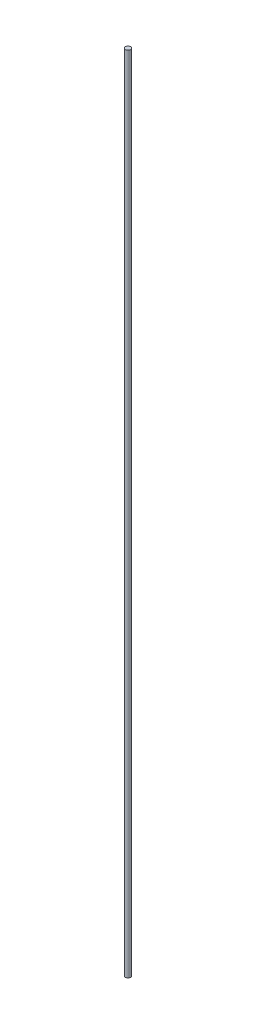
ISO-10303-21;
HEADER;
FILE_DESCRIPTION(('STEP AP214'),'2;1');
FILE_NAME('part.step','',(''),(''),'','','');
FILE_SCHEMA(('AUTOMOTIVE_DESIGN { 1 0 10303 214 1 1 1 1 }'));
ENDSEC;
DATA;
#1=APPLICATION_CONTEXT('core data for automotive mechanical design processes');
#2=APPLICATION_PROTOCOL_DEFINITION('international standard','automotive_design',2000,#1);
#3=PRODUCT_CONTEXT('',#1,'mechanical');
#4=PRODUCT('Part','Part','',(#3));
#5=PRODUCT_RELATED_PRODUCT_CATEGORY('part','',(#4));
#6=PRODUCT_DEFINITION_FORMATION('','',#4);
#7=PRODUCT_DEFINITION_CONTEXT('part definition',#1,'design');
#8=PRODUCT_DEFINITION('design','',#6,#7);
#9=PRODUCT_DEFINITION_SHAPE('','',#8);
#10=(LENGTH_UNIT() NAMED_UNIT(*) SI_UNIT(.MILLI.,.METRE.));
#11=(NAMED_UNIT(*) PLANE_ANGLE_UNIT() SI_UNIT($,.RADIAN.));
#12=(NAMED_UNIT(*) SI_UNIT($,.STERADIAN.) SOLID_ANGLE_UNIT());
#13=UNCERTAINTY_MEASURE_WITH_UNIT(LENGTH_MEASURE(1.E-05),#10,'distance_accuracy_value','');
#14=(GEOMETRIC_REPRESENTATION_CONTEXT(3) GLOBAL_UNCERTAINTY_ASSIGNED_CONTEXT((#13)) GLOBAL_UNIT_ASSIGNED_CONTEXT((#10,
#11,#12)) REPRESENTATION_CONTEXT('',''));
#15=CARTESIAN_POINT('',(0.,0.,0.));
#16=DIRECTION('',(0.,0.,1.));
#17=DIRECTION('',(1.,0.,0.));
#18=AXIS2_PLACEMENT_3D('',#15,#16,#17);
#19=CARTESIAN_POINT('',(0.,0.,0.));
#20=DIRECTION('',(0.,1.,0.));
#21=DIRECTION('',(0.,0.,1.));
#22=AXIS2_PLACEMENT_3D('',#19,#20,#21);
#23=PLANE('',#22);
#24=CARTESIAN_POINT('',(0.,0.,0.));
#25=DIRECTION('',(0.,1.,0.));
#26=DIRECTION('',(0.,0.,1.));
#27=AXIS2_PLACEMENT_3D('',#24,#25,#26);
#28=CIRCLE('',#27,6.35);
#29=CARTESIAN_POINT('',(0.,0.,6.35));
#30=VERTEX_POINT('',#29);
#31=EDGE_CURVE('E48',#30,#30,#28,.T.);
#32=ORIENTED_EDGE('',*,*,#31,.F.);
#33=EDGE_LOOP('',(#32));
#34=FACE_BOUND('',#33,.T.);
#35=ADVANCED_FACE('F42',(#34),#23,.F.);
#36=CARTESIAN_POINT('',(0.,1968.246,0.));
#37=DIRECTION('',(0.,1.,0.));
#38=DIRECTION('',(0.,0.,1.));
#39=AXIS2_PLACEMENT_3D('',#36,#37,#38);
#40=PLANE('',#39);
#41=CARTESIAN_POINT('',(0.,1968.246,0.));
#42=DIRECTION('',(0.,1.,0.));
#43=DIRECTION('',(0.,0.,1.));
#44=AXIS2_PLACEMENT_3D('',#41,#42,#43);
#45=CIRCLE('',#44,6.35);
#46=CARTESIAN_POINT('',(0.,1968.246,6.35));
#47=VERTEX_POINT('',#46);
#48=EDGE_CURVE('E11',#47,#47,#45,.T.);
#49=ORIENTED_EDGE('',*,*,#48,.T.);
#50=EDGE_LOOP('',(#49));
#51=FACE_BOUND('',#50,.T.);
#52=ADVANCED_FACE('F57',(#51),#40,.T.);
#53=CARTESIAN_POINT('',(0.,0.,0.));
#54=DIRECTION('',(0.,1.,0.));
#55=DIRECTION('',(0.,0.,1.));
#56=AXIS2_PLACEMENT_3D('',#53,#54,#55);
#57=CYLINDRICAL_SURFACE('',#56,6.35);
#58=ORIENTED_EDGE('',*,*,#48,.F.);
#59=EDGE_LOOP('',(#58));
#60=FACE_BOUND('',#59,.T.);
#61=ORIENTED_EDGE('',*,*,#31,.T.);
#62=EDGE_LOOP('',(#61));
#63=FACE_BOUND('',#62,.T.);
#64=ADVANCED_FACE('F54',(#60,#63),#57,.T.);
#65=CLOSED_SHELL('',(#35,#52,#64));
#66=MANIFOLD_SOLID_BREP('B2',#65);
#67=ADVANCED_BREP_SHAPE_REPRESENTATION('',(#18,#66),#14);
#68=SHAPE_DEFINITION_REPRESENTATION(#9,#67);
ENDSEC;
END-ISO-10303-21;
